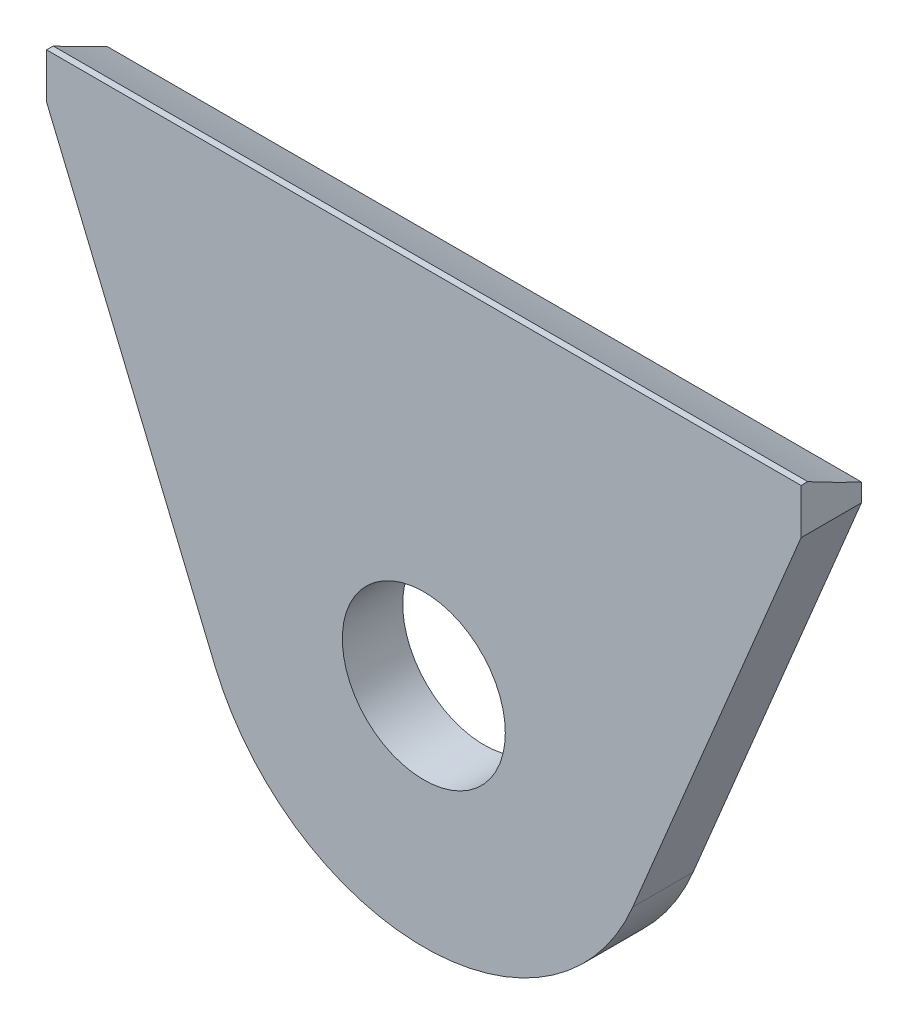
ISO-10303-21;
HEADER;
FILE_DESCRIPTION(('STEP AP214'),'2;1');
FILE_NAME('part.step','',(''),(''),'','','');
FILE_SCHEMA(('AUTOMOTIVE_DESIGN { 1 0 10303 214 1 1 1 1 }'));
ENDSEC;
DATA;
#1=APPLICATION_CONTEXT('core data for automotive mechanical design processes');
#2=APPLICATION_PROTOCOL_DEFINITION('international standard','automotive_design',2000,#1);
#3=PRODUCT_CONTEXT('',#1,'mechanical');
#4=PRODUCT('Part','Part','',(#3));
#5=PRODUCT_RELATED_PRODUCT_CATEGORY('part','',(#4));
#6=PRODUCT_DEFINITION_FORMATION('','',#4);
#7=PRODUCT_DEFINITION_CONTEXT('part definition',#1,'design');
#8=PRODUCT_DEFINITION('design','',#6,#7);
#9=PRODUCT_DEFINITION_SHAPE('','',#8);
#10=(LENGTH_UNIT() NAMED_UNIT(*) SI_UNIT(.MILLI.,.METRE.));
#11=(NAMED_UNIT(*) PLANE_ANGLE_UNIT() SI_UNIT($,.RADIAN.));
#12=(NAMED_UNIT(*) SI_UNIT($,.STERADIAN.) SOLID_ANGLE_UNIT());
#13=UNCERTAINTY_MEASURE_WITH_UNIT(LENGTH_MEASURE(1.E-05),#10,'distance_accuracy_value','');
#14=(GEOMETRIC_REPRESENTATION_CONTEXT(3) GLOBAL_UNCERTAINTY_ASSIGNED_CONTEXT((#13)) GLOBAL_UNIT_ASSIGNED_CONTEXT((#10,
#11,#12)) REPRESENTATION_CONTEXT('',''));
#15=CARTESIAN_POINT('',(0.,0.,0.));
#16=DIRECTION('',(0.,0.,1.));
#17=DIRECTION('',(1.,0.,0.));
#18=AXIS2_PLACEMENT_3D('',#15,#16,#17);
#19=CARTESIAN_POINT('',(0.,0.,0.));
#20=DIRECTION('',(0.,0.,1.));
#21=DIRECTION('',(1.,0.,0.));
#22=AXIS2_PLACEMENT_3D('',#19,#20,#21);
#23=PLANE('',#22);
#24=CARTESIAN_POINT('',(0.,0.,0.));
#25=DIRECTION('',(0.,0.,1.));
#26=DIRECTION('',(1.,0.,0.));
#27=AXIS2_PLACEMENT_3D('',#24,#25,#26);
#28=CIRCLE('',#27,5.4);
#29=CARTESIAN_POINT('',(5.4,0.,0.));
#30=VERTEX_POINT('',#29);
#31=EDGE_CURVE('E172',#30,#30,#28,.T.);
#32=ORIENTED_EDGE('',*,*,#31,.T.);
#33=EDGE_LOOP('',(#32));
#34=FACE_BOUND('',#33,.T.);
#35=DIRECTION('',(1.00000000000001,0.,0.));
#36=VECTOR('',#35,1.);
#37=CARTESIAN_POINT('',(-1000.00000000002,22.2014890455892,0.));
#38=LINE('',#37,#36);
#39=CARTESIAN_POINT('',(24.9999999999999,22.2014890455898,0.));
#40=VERTEX_POINT('',#39);
#41=CARTESIAN_POINT('',(-25.,22.2014890455898,0.));
#42=VERTEX_POINT('',#41);
#43=EDGE_CURVE('E59',#40,#42,#38,.F.);
#44=ORIENTED_EDGE('',*,*,#43,.F.);
#45=DIRECTION('',(0.,1.,0.));
#46=VECTOR('',#45,1.);
#47=CARTESIAN_POINT('',(25.,24.,0.));
#48=LINE('',#47,#46);
#49=CARTESIAN_POINT('',(25.,21.,0.));
#50=VERTEX_POINT('',#49);
#51=EDGE_CURVE('E143',#50,#40,#48,.T.);
#52=ORIENTED_EDGE('',*,*,#51,.F.);
#53=DIRECTION('',(0.384615384615385,0.923076923076923,0.));
#54=VECTOR('',#53,1.);
#55=CARTESIAN_POINT('',(25.,21.,0.));
#56=LINE('',#55,#54);
#57=CARTESIAN_POINT('',(13.8461538461538,-5.76923076923077,0.));
#58=VERTEX_POINT('',#57);
#59=EDGE_CURVE('E141',#58,#50,#56,.T.);
#60=ORIENTED_EDGE('',*,*,#59,.F.);
#61=CARTESIAN_POINT('',(0.,0.,0.));
#62=DIRECTION('',(0.,0.,1.));
#63=DIRECTION('',(1.,0.,0.));
#64=AXIS2_PLACEMENT_3D('',#61,#62,#63);
#65=CIRCLE('',#64,15.);
#66=CARTESIAN_POINT('',(-13.8461538461538,-5.76923076923077,0.));
#67=VERTEX_POINT('',#66);
#68=EDGE_CURVE('E140',#67,#58,#65,.T.);
#69=ORIENTED_EDGE('',*,*,#68,.F.);
#70=DIRECTION('',(0.384615384615385,-0.923076923076923,0.));
#71=VECTOR('',#70,1.);
#72=CARTESIAN_POINT('',(-25.,21.,0.));
#73=LINE('',#72,#71);
#74=CARTESIAN_POINT('',(-25.,21.,0.));
#75=VERTEX_POINT('',#74);
#76=EDGE_CURVE('E137',#75,#67,#73,.T.);
#77=ORIENTED_EDGE('',*,*,#76,.F.);
#78=DIRECTION('',(0.,-1.,0.));
#79=VECTOR('',#78,1.);
#80=CARTESIAN_POINT('',(-25.,24.,0.));
#81=LINE('',#80,#79);
#82=EDGE_CURVE('E90',#42,#75,#81,.T.);
#83=ORIENTED_EDGE('',*,*,#82,.F.);
#84=EDGE_LOOP('',(#44,#52,#60,#69,#77,#83));
#85=FACE_BOUND('',#84,.T.);
#86=ADVANCED_FACE('F42',(#34,#85),#23,.F.);
#87=CARTESIAN_POINT('',(-25.,24.,4.));
#88=DIRECTION('',(0.,-1.,0.));
#89=DIRECTION('',(0.,0.,-1.));
#90=AXIS2_PLACEMENT_3D('',#87,#88,#89);
#91=PLANE('',#90);
#92=DIRECTION('',(1.00000000000001,0.,0.));
#93=VECTOR('',#92,1.);
#94=CARTESIAN_POINT('',(-1000.00000000002,24.,3.55964838910015));
#95=LINE('',#94,#93);
#96=CARTESIAN_POINT('',(-25.,24.,3.55964838909972));
#97=VERTEX_POINT('',#96);
#98=CARTESIAN_POINT('',(25.0000000000001,24.0000000000001,3.55964838910015));
#99=VERTEX_POINT('',#98);
#100=EDGE_CURVE('E168',#97,#99,#95,.T.);
#101=ORIENTED_EDGE('',*,*,#100,.F.);
#102=DIRECTION('',(0.,0.,-1.));
#103=VECTOR('',#102,1.);
#104=CARTESIAN_POINT('',(-25.,24.,4.));
#105=LINE('',#104,#103);
#106=CARTESIAN_POINT('',(-25.,24.,4.));
#107=VERTEX_POINT('',#106);
#108=EDGE_CURVE('E126',#107,#97,#105,.T.);
#109=ORIENTED_EDGE('',*,*,#108,.F.);
#110=DIRECTION('',(-1.,0.,0.));
#111=VECTOR('',#110,1.);
#112=CARTESIAN_POINT('',(-25.,24.,4.));
#113=LINE('',#112,#111);
#114=CARTESIAN_POINT('',(25.,24.,4.));
#115=VERTEX_POINT('',#114);
#116=EDGE_CURVE('E109',#115,#107,#113,.T.);
#117=ORIENTED_EDGE('',*,*,#116,.F.);
#118=DIRECTION('',(0.,0.,-1.));
#119=VECTOR('',#118,1.);
#120=CARTESIAN_POINT('',(25.,24.,4.));
#121=LINE('',#120,#119);
#122=EDGE_CURVE('E119',#115,#99,#121,.T.);
#123=ORIENTED_EDGE('',*,*,#122,.T.);
#124=EDGE_LOOP('',(#101,#109,#117,#123));
#125=FACE_BOUND('',#124,.T.);
#126=ADVANCED_FACE('F127',(#125),#91,.F.);
#127=CARTESIAN_POINT('',(0.,0.,4.));
#128=DIRECTION('',(0.,0.,1.));
#129=DIRECTION('',(1.,0.,0.));
#130=AXIS2_PLACEMENT_3D('',#127,#128,#129);
#131=PLANE('',#130);
#132=DIRECTION('',(0.384615384615385,-0.923076923076923,0.));
#133=VECTOR('',#132,1.);
#134=CARTESIAN_POINT('',(-25.,21.,4.));
#135=LINE('',#134,#133);
#136=CARTESIAN_POINT('',(-25.,21.,4.));
#137=VERTEX_POINT('',#136);
#138=CARTESIAN_POINT('',(-13.8461538461538,-5.76923076923077,4.));
#139=VERTEX_POINT('',#138);
#140=EDGE_CURVE('E146',#137,#139,#135,.T.);
#141=ORIENTED_EDGE('',*,*,#140,.T.);
#142=CARTESIAN_POINT('',(0.,0.,4.));
#143=DIRECTION('',(0.,0.,1.));
#144=DIRECTION('',(1.,0.,0.));
#145=AXIS2_PLACEMENT_3D('',#142,#143,#144);
#146=CIRCLE('',#145,15.);
#147=CARTESIAN_POINT('',(13.8461538461538,-5.76923076923077,4.));
#148=VERTEX_POINT('',#147);
#149=EDGE_CURVE('E98',#139,#148,#146,.T.);
#150=ORIENTED_EDGE('',*,*,#149,.T.);
#151=DIRECTION('',(0.384615384615385,0.923076923076923,0.));
#152=VECTOR('',#151,1.);
#153=CARTESIAN_POINT('',(25.,21.,4.));
#154=LINE('',#153,#152);
#155=CARTESIAN_POINT('',(25.,21.,4.));
#156=VERTEX_POINT('',#155);
#157=EDGE_CURVE('E113',#148,#156,#154,.T.);
#158=ORIENTED_EDGE('',*,*,#157,.T.);
#159=DIRECTION('',(0.,1.,0.));
#160=VECTOR('',#159,1.);
#161=CARTESIAN_POINT('',(25.,24.,4.));
#162=LINE('',#161,#160);
#163=EDGE_CURVE('E102',#156,#115,#162,.T.);
#164=ORIENTED_EDGE('',*,*,#163,.T.);
#165=ORIENTED_EDGE('',*,*,#116,.T.);
#166=DIRECTION('',(0.,-1.,0.));
#167=VECTOR('',#166,1.);
#168=CARTESIAN_POINT('',(-25.,24.,4.));
#169=LINE('',#168,#167);
#170=EDGE_CURVE('E70',#107,#137,#169,.T.);
#171=ORIENTED_EDGE('',*,*,#170,.T.);
#172=EDGE_LOOP('',(#141,#150,#158,#164,#165,#171));
#173=FACE_BOUND('',#172,.T.);
#174=CARTESIAN_POINT('',(0.,0.,4.));
#175=DIRECTION('',(0.,0.,1.));
#176=DIRECTION('',(1.,0.,0.));
#177=AXIS2_PLACEMENT_3D('',#174,#175,#176);
#178=CIRCLE('',#177,5.4);
#179=CARTESIAN_POINT('',(5.4,0.,4.));
#180=VERTEX_POINT('',#179);
#181=EDGE_CURVE('E142',#180,#180,#178,.T.);
#182=ORIENTED_EDGE('',*,*,#181,.F.);
#183=EDGE_LOOP('',(#182));
#184=FACE_BOUND('',#183,.T.);
#185=ADVANCED_FACE('F110',(#173,#184),#131,.T.);
#186=CARTESIAN_POINT('',(-25.,21.,4.));
#187=DIRECTION('',(0.923076923076923,0.384615384615385,0.));
#188=DIRECTION('',(-0.384615384615385,0.923076923076923,0.));
#189=AXIS2_PLACEMENT_3D('',#186,#187,#188);
#190=PLANE('',#189);
#191=ORIENTED_EDGE('',*,*,#76,.T.);
#192=DIRECTION('',(0.,0.,-1.));
#193=VECTOR('',#192,1.);
#194=CARTESIAN_POINT('',(-13.8461538461538,-5.76923076923077,4.));
#195=LINE('',#194,#193);
#196=EDGE_CURVE('E55',#139,#67,#195,.T.);
#197=ORIENTED_EDGE('',*,*,#196,.F.);
#198=ORIENTED_EDGE('',*,*,#140,.F.);
#199=DIRECTION('',(0.,0.,-1.));
#200=VECTOR('',#199,1.);
#201=CARTESIAN_POINT('',(-25.,21.,4.));
#202=LINE('',#201,#200);
#203=EDGE_CURVE('E131',#137,#75,#202,.T.);
#204=ORIENTED_EDGE('',*,*,#203,.T.);
#205=EDGE_LOOP('',(#191,#197,#198,#204));
#206=FACE_BOUND('',#205,.T.);
#207=ADVANCED_FACE('F46',(#206),#190,.F.);
#208=CARTESIAN_POINT('',(0.,0.,4.));
#209=DIRECTION('',(0.,0.,-1.));
#210=DIRECTION('',(-1.,0.,0.));
#211=AXIS2_PLACEMENT_3D('',#208,#209,#210);
#212=CYLINDRICAL_SURFACE('',#211,15.);
#213=ORIENTED_EDGE('',*,*,#68,.T.);
#214=DIRECTION('',(0.,0.,-1.));
#215=VECTOR('',#214,1.);
#216=CARTESIAN_POINT('',(13.8461538461538,-5.76923076923077,4.));
#217=LINE('',#216,#215);
#218=EDGE_CURVE('E155',#148,#58,#217,.T.);
#219=ORIENTED_EDGE('',*,*,#218,.F.);
#220=ORIENTED_EDGE('',*,*,#149,.F.);
#221=ORIENTED_EDGE('',*,*,#196,.T.);
#222=EDGE_LOOP('',(#213,#219,#220,#221));
#223=FACE_BOUND('',#222,.T.);
#224=ADVANCED_FACE('F154',(#223),#212,.T.);
#225=CARTESIAN_POINT('',(25.,21.,4.));
#226=DIRECTION('',(-0.923076923076923,0.384615384615385,0.));
#227=DIRECTION('',(-0.384615384615385,-0.923076923076923,0.));
#228=AXIS2_PLACEMENT_3D('',#225,#226,#227);
#229=PLANE('',#228);
#230=ORIENTED_EDGE('',*,*,#59,.T.);
#231=DIRECTION('',(0.,0.,-1.));
#232=VECTOR('',#231,1.);
#233=CARTESIAN_POINT('',(25.,21.,4.));
#234=LINE('',#233,#232);
#235=EDGE_CURVE('E130',#156,#50,#234,.T.);
#236=ORIENTED_EDGE('',*,*,#235,.F.);
#237=ORIENTED_EDGE('',*,*,#157,.F.);
#238=ORIENTED_EDGE('',*,*,#218,.T.);
#239=EDGE_LOOP('',(#230,#236,#237,#238));
#240=FACE_BOUND('',#239,.T.);
#241=ADVANCED_FACE('F161',(#240),#229,.F.);
#242=CARTESIAN_POINT('',(25.,24.,4.));
#243=DIRECTION('',(-1.,0.,0.));
#244=DIRECTION('',(0.,0.,1.));
#245=AXIS2_PLACEMENT_3D('',#242,#243,#244);
#246=PLANE('',#245);
#247=CARTESIAN_POINT('',(24.9999999999999,86.,-30.));
#248=DIRECTION('',(-1.,0.,0.));
#249=DIRECTION('',(0.,0.,1.));
#250=AXIS2_PLACEMENT_3D('',#247,#248,#249);
#251=CIRCLE('',#250,70.5);
#252=EDGE_CURVE('E121',#99,#40,#251,.F.);
#253=ORIENTED_EDGE('',*,*,#252,.F.);
#254=ORIENTED_EDGE('',*,*,#122,.F.);
#255=ORIENTED_EDGE('',*,*,#163,.F.);
#256=ORIENTED_EDGE('',*,*,#235,.T.);
#257=ORIENTED_EDGE('',*,*,#51,.T.);
#258=EDGE_LOOP('',(#253,#254,#255,#256,#257));
#259=FACE_BOUND('',#258,.T.);
#260=ADVANCED_FACE('F122',(#259),#246,.F.);
#261=CARTESIAN_POINT('',(-25.,24.,4.));
#262=DIRECTION('',(1.,0.,0.));
#263=DIRECTION('',(0.,0.,-1.));
#264=AXIS2_PLACEMENT_3D('',#261,#262,#263);
#265=PLANE('',#264);
#266=CARTESIAN_POINT('',(-25.,86.,-30.));
#267=DIRECTION('',(1.,0.,0.));
#268=DIRECTION('',(0.,0.,-1.));
#269=AXIS2_PLACEMENT_3D('',#266,#267,#268);
#270=CIRCLE('',#269,70.5);
#271=EDGE_CURVE('E12',#42,#97,#270,.F.);
#272=ORIENTED_EDGE('',*,*,#271,.F.);
#273=ORIENTED_EDGE('',*,*,#82,.T.);
#274=ORIENTED_EDGE('',*,*,#203,.F.);
#275=ORIENTED_EDGE('',*,*,#170,.F.);
#276=ORIENTED_EDGE('',*,*,#108,.T.);
#277=EDGE_LOOP('',(#272,#273,#274,#275,#276));
#278=FACE_BOUND('',#277,.T.);
#279=ADVANCED_FACE('F167',(#278),#265,.F.);
#280=CARTESIAN_POINT('',(0.,0.,4.));
#281=DIRECTION('',(0.,0.,-1.));
#282=DIRECTION('',(-1.,0.,0.));
#283=AXIS2_PLACEMENT_3D('',#280,#281,#282);
#284=CYLINDRICAL_SURFACE('',#283,5.4);
#285=ORIENTED_EDGE('',*,*,#181,.T.);
#286=EDGE_LOOP('',(#285));
#287=FACE_BOUND('',#286,.T.);
#288=ORIENTED_EDGE('',*,*,#31,.F.);
#289=EDGE_LOOP('',(#288));
#290=FACE_BOUND('',#289,.T.);
#291=ADVANCED_FACE('F185',(#287,#290),#284,.F.);
#292=CARTESIAN_POINT('',(-1000.00000000002,85.9999999999999,-30.));
#293=DIRECTION('',(1.00000000000001,0.,0.));
#294=DIRECTION('',(0.,-1.00000000000001,0.));
#295=AXIS2_PLACEMENT_3D('',#292,#293,#294);
#296=CYLINDRICAL_SURFACE('',#295,70.5);
#297=ORIENTED_EDGE('',*,*,#43,.T.);
#298=ORIENTED_EDGE('',*,*,#271,.T.);
#299=ORIENTED_EDGE('',*,*,#100,.T.);
#300=ORIENTED_EDGE('',*,*,#252,.T.);
#301=EDGE_LOOP('',(#297,#298,#299,#300));
#302=FACE_BOUND('',#301,.T.);
#303=ADVANCED_FACE('F166',(#302),#296,.F.);
#304=CLOSED_SHELL('',(#86,#126,#185,#207,#224,#241,#260,#279,#291,#303));
#305=MANIFOLD_SOLID_BREP('B2',#304);
#306=ADVANCED_BREP_SHAPE_REPRESENTATION('',(#18,#305),#14);
#307=SHAPE_DEFINITION_REPRESENTATION(#9,#306);
ENDSEC;
END-ISO-10303-21;
